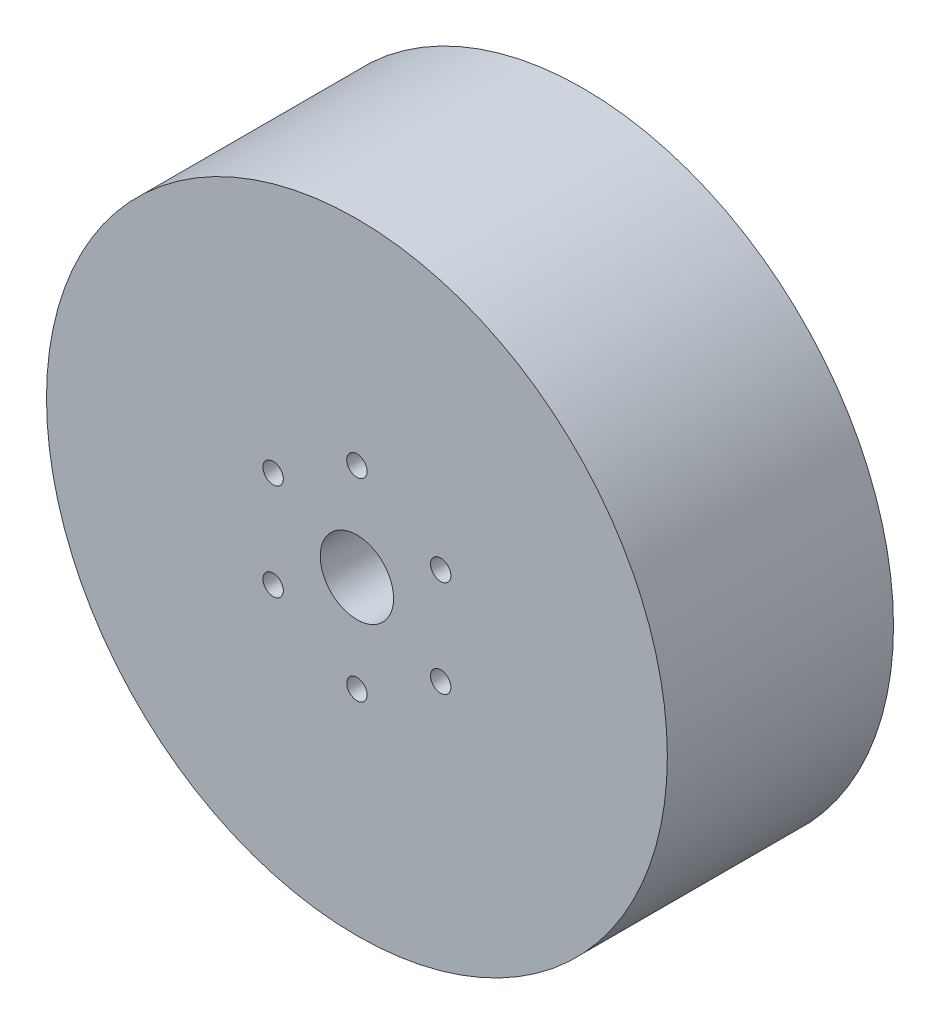
ISO-10303-21;
HEADER;
FILE_DESCRIPTION(('STEP AP214'),'2;1');
FILE_NAME('part.step','',(''),(''),'','','');
FILE_SCHEMA(('AUTOMOTIVE_DESIGN { 1 0 10303 214 1 1 1 1 }'));
ENDSEC;
DATA;
#1=APPLICATION_CONTEXT('core data for automotive mechanical design processes');
#2=APPLICATION_PROTOCOL_DEFINITION('international standard','automotive_design',2000,#1);
#3=PRODUCT_CONTEXT('',#1,'mechanical');
#4=PRODUCT('Part','Part','',(#3));
#5=PRODUCT_RELATED_PRODUCT_CATEGORY('part','',(#4));
#6=PRODUCT_DEFINITION_FORMATION('','',#4);
#7=PRODUCT_DEFINITION_CONTEXT('part definition',#1,'design');
#8=PRODUCT_DEFINITION('design','',#6,#7);
#9=PRODUCT_DEFINITION_SHAPE('','',#8);
#10=(LENGTH_UNIT() NAMED_UNIT(*) SI_UNIT(.MILLI.,.METRE.));
#11=(NAMED_UNIT(*) PLANE_ANGLE_UNIT() SI_UNIT($,.RADIAN.));
#12=(NAMED_UNIT(*) SI_UNIT($,.STERADIAN.) SOLID_ANGLE_UNIT());
#13=UNCERTAINTY_MEASURE_WITH_UNIT(LENGTH_MEASURE(1.E-05),#10,'distance_accuracy_value','');
#14=(GEOMETRIC_REPRESENTATION_CONTEXT(3) GLOBAL_UNCERTAINTY_ASSIGNED_CONTEXT((#13)) GLOBAL_UNIT_ASSIGNED_CONTEXT((#10,
#11,#12)) REPRESENTATION_CONTEXT('',''));
#15=CARTESIAN_POINT('',(0.,0.,0.));
#16=DIRECTION('',(0.,0.,1.));
#17=DIRECTION('',(1.,0.,0.));
#18=AXIS2_PLACEMENT_3D('',#15,#16,#17);
#19=CARTESIAN_POINT('',(0.,0.,55.52));
#20=DIRECTION('',(0.,0.,1.));
#21=DIRECTION('',(1.,0.,0.));
#22=AXIS2_PLACEMENT_3D('',#19,#20,#21);
#23=PLANE('',#22);
#24=CARTESIAN_POINT('',(-20.566603339879,-11.8758660254045,55.52));
#25=DIRECTION('',(0.,0.,1.));
#26=DIRECTION('',(1.,0.,0.));
#27=AXIS2_PLACEMENT_3D('',#24,#25,#26);
#28=CIRCLE('',#27,2.5);
#29=CARTESIAN_POINT('',(-18.066603339879,-11.8758660254045,55.52));
#30=VERTEX_POINT('',#29);
#31=EDGE_CURVE('E70',#30,#30,#28,.T.);
#32=ORIENTED_EDGE('',*,*,#31,.F.);
#33=EDGE_LOOP('',(#32));
#34=FACE_BOUND('',#33,.T.);
#35=CARTESIAN_POINT('',(20.5696033398819,-11.8741339745955,55.52));
#36=DIRECTION('',(0.,0.,1.));
#37=DIRECTION('',(1.,0.,0.));
#38=AXIS2_PLACEMENT_3D('',#35,#36,#37);
#39=CIRCLE('',#38,2.5);
#40=CARTESIAN_POINT('',(23.0696033398819,-11.8741339745955,55.52));
#41=VERTEX_POINT('',#40);
#42=EDGE_CURVE('E58',#41,#41,#39,.T.);
#43=ORIENTED_EDGE('',*,*,#42,.F.);
#44=EDGE_LOOP('',(#43));
#45=FACE_BOUND('',#44,.T.);
#46=CARTESIAN_POINT('',(0.,23.75,55.52));
#47=DIRECTION('',(0.,0.,1.));
#48=DIRECTION('',(1.,0.,0.));
#49=AXIS2_PLACEMENT_3D('',#46,#47,#48);
#50=CIRCLE('',#49,2.5);
#51=CARTESIAN_POINT('',(2.5,23.75,55.52));
#52=VERTEX_POINT('',#51);
#53=EDGE_CURVE('E46',#52,#52,#50,.T.);
#54=ORIENTED_EDGE('',*,*,#53,.F.);
#55=EDGE_LOOP('',(#54));
#56=FACE_BOUND('',#55,.T.);
#57=CARTESIAN_POINT('',(0.,0.,55.52));
#58=DIRECTION('',(0.,0.,1.));
#59=DIRECTION('',(1.,0.,0.));
#60=AXIS2_PLACEMENT_3D('',#57,#58,#59);
#61=CIRCLE('',#60,76.2);
#62=CARTESIAN_POINT('',(76.2,0.,55.52));
#63=VERTEX_POINT('',#62);
#64=EDGE_CURVE('E10',#63,#63,#61,.T.);
#65=ORIENTED_EDGE('',*,*,#64,.T.);
#66=EDGE_LOOP('',(#65));
#67=FACE_BOUND('',#66,.T.);
#68=CARTESIAN_POINT('',(0.,0.,55.52));
#69=DIRECTION('',(0.,0.,1.));
#70=DIRECTION('',(1.,0.,0.));
#71=AXIS2_PLACEMENT_3D('',#68,#69,#70);
#72=CIRCLE('',#71,9.);
#73=CARTESIAN_POINT('',(9.,0.,55.52));
#74=VERTEX_POINT('',#73);
#75=EDGE_CURVE('E41',#74,#74,#72,.T.);
#76=ORIENTED_EDGE('',*,*,#75,.F.);
#77=EDGE_LOOP('',(#76));
#78=FACE_BOUND('',#77,.T.);
#79=CARTESIAN_POINT('',(20.568603339881,11.8758660254046,55.52));
#80=DIRECTION('',(0.,0.,1.));
#81=DIRECTION('',(1.,0.,0.));
#82=AXIS2_PLACEMENT_3D('',#79,#80,#81);
#83=CIRCLE('',#82,2.5);
#84=CARTESIAN_POINT('',(23.068603339881,11.8758660254046,55.52));
#85=VERTEX_POINT('',#84);
#86=EDGE_CURVE('E52',#85,#85,#83,.T.);
#87=ORIENTED_EDGE('',*,*,#86,.F.);
#88=EDGE_LOOP('',(#87));
#89=FACE_BOUND('',#88,.T.);
#90=CARTESIAN_POINT('',(0.00200000000184575,-23.75,55.52));
#91=DIRECTION('',(0.,0.,1.));
#92=DIRECTION('',(1.,0.,0.));
#93=AXIS2_PLACEMENT_3D('',#90,#91,#92);
#94=CIRCLE('',#93,2.5);
#95=CARTESIAN_POINT('',(2.50200000000185,-23.75,55.52));
#96=VERTEX_POINT('',#95);
#97=EDGE_CURVE('E64',#96,#96,#94,.T.);
#98=ORIENTED_EDGE('',*,*,#97,.F.);
#99=EDGE_LOOP('',(#98));
#100=FACE_BOUND('',#99,.T.);
#101=CARTESIAN_POINT('',(-20.5676033398798,11.8741339745956,55.52));
#102=DIRECTION('',(0.,0.,1.));
#103=DIRECTION('',(1.,0.,0.));
#104=AXIS2_PLACEMENT_3D('',#101,#102,#103);
#105=CIRCLE('',#104,2.5);
#106=CARTESIAN_POINT('',(-18.0676033398798,11.8741339745956,55.52));
#107=VERTEX_POINT('',#106);
#108=EDGE_CURVE('E76',#107,#107,#105,.T.);
#109=ORIENTED_EDGE('',*,*,#108,.F.);
#110=EDGE_LOOP('',(#109));
#111=FACE_BOUND('',#110,.T.);
#112=ADVANCED_FACE('F30',(#34,#45,#56,#67,#78,#89,#100,#111),#23,.T.);
#113=CARTESIAN_POINT('',(0.,0.,0.));
#114=DIRECTION('',(0.,0.,1.));
#115=DIRECTION('',(1.,0.,0.));
#116=AXIS2_PLACEMENT_3D('',#113,#114,#115);
#117=PLANE('',#116);
#118=CARTESIAN_POINT('',(0.,0.,0.));
#119=DIRECTION('',(0.,0.,1.));
#120=DIRECTION('',(1.,0.,0.));
#121=AXIS2_PLACEMENT_3D('',#118,#119,#120);
#122=CIRCLE('',#121,76.2);
#123=CARTESIAN_POINT('',(76.2,0.,0.));
#124=VERTEX_POINT('',#123);
#125=EDGE_CURVE('E34',#124,#124,#122,.T.);
#126=ORIENTED_EDGE('',*,*,#125,.F.);
#127=EDGE_LOOP('',(#126));
#128=FACE_BOUND('',#127,.T.);
#129=CARTESIAN_POINT('',(0.,0.,0.));
#130=DIRECTION('',(0.,0.,1.));
#131=DIRECTION('',(1.,0.,0.));
#132=AXIS2_PLACEMENT_3D('',#129,#130,#131);
#133=CIRCLE('',#132,9.);
#134=CARTESIAN_POINT('',(9.,0.,0.));
#135=VERTEX_POINT('',#134);
#136=EDGE_CURVE('E43',#135,#135,#133,.T.);
#137=ORIENTED_EDGE('',*,*,#136,.T.);
#138=EDGE_LOOP('',(#137));
#139=FACE_BOUND('',#138,.T.);
#140=CARTESIAN_POINT('',(0.,23.75,0.));
#141=DIRECTION('',(0.,0.,1.));
#142=DIRECTION('',(1.,0.,0.));
#143=AXIS2_PLACEMENT_3D('',#140,#141,#142);
#144=CIRCLE('',#143,2.5);
#145=CARTESIAN_POINT('',(2.5,23.75,0.));
#146=VERTEX_POINT('',#145);
#147=EDGE_CURVE('E49',#146,#146,#144,.T.);
#148=ORIENTED_EDGE('',*,*,#147,.T.);
#149=EDGE_LOOP('',(#148));
#150=FACE_BOUND('',#149,.T.);
#151=CARTESIAN_POINT('',(20.568603339881,11.8758660254046,0.));
#152=DIRECTION('',(0.,0.,1.));
#153=DIRECTION('',(1.,0.,0.));
#154=AXIS2_PLACEMENT_3D('',#151,#152,#153);
#155=CIRCLE('',#154,2.5);
#156=CARTESIAN_POINT('',(23.068603339881,11.8758660254046,0.));
#157=VERTEX_POINT('',#156);
#158=EDGE_CURVE('E55',#157,#157,#155,.T.);
#159=ORIENTED_EDGE('',*,*,#158,.T.);
#160=EDGE_LOOP('',(#159));
#161=FACE_BOUND('',#160,.T.);
#162=CARTESIAN_POINT('',(20.5696033398819,-11.8741339745955,0.));
#163=DIRECTION('',(0.,0.,1.));
#164=DIRECTION('',(1.,0.,0.));
#165=AXIS2_PLACEMENT_3D('',#162,#163,#164);
#166=CIRCLE('',#165,2.5);
#167=CARTESIAN_POINT('',(23.0696033398819,-11.8741339745955,0.));
#168=VERTEX_POINT('',#167);
#169=EDGE_CURVE('E61',#168,#168,#166,.T.);
#170=ORIENTED_EDGE('',*,*,#169,.T.);
#171=EDGE_LOOP('',(#170));
#172=FACE_BOUND('',#171,.T.);
#173=CARTESIAN_POINT('',(0.00200000000184575,-23.75,0.));
#174=DIRECTION('',(0.,0.,1.));
#175=DIRECTION('',(1.,0.,0.));
#176=AXIS2_PLACEMENT_3D('',#173,#174,#175);
#177=CIRCLE('',#176,2.5);
#178=CARTESIAN_POINT('',(2.50200000000185,-23.75,0.));
#179=VERTEX_POINT('',#178);
#180=EDGE_CURVE('E67',#179,#179,#177,.T.);
#181=ORIENTED_EDGE('',*,*,#180,.T.);
#182=EDGE_LOOP('',(#181));
#183=FACE_BOUND('',#182,.T.);
#184=CARTESIAN_POINT('',(-20.566603339879,-11.8758660254045,0.));
#185=DIRECTION('',(0.,0.,1.));
#186=DIRECTION('',(1.,0.,0.));
#187=AXIS2_PLACEMENT_3D('',#184,#185,#186);
#188=CIRCLE('',#187,2.5);
#189=CARTESIAN_POINT('',(-18.066603339879,-11.8758660254045,0.));
#190=VERTEX_POINT('',#189);
#191=EDGE_CURVE('E73',#190,#190,#188,.T.);
#192=ORIENTED_EDGE('',*,*,#191,.T.);
#193=EDGE_LOOP('',(#192));
#194=FACE_BOUND('',#193,.T.);
#195=CARTESIAN_POINT('',(-20.5676033398798,11.8741339745956,0.));
#196=DIRECTION('',(0.,0.,1.));
#197=DIRECTION('',(1.,0.,0.));
#198=AXIS2_PLACEMENT_3D('',#195,#196,#197);
#199=CIRCLE('',#198,2.5);
#200=CARTESIAN_POINT('',(-18.0676033398798,11.8741339745956,0.));
#201=VERTEX_POINT('',#200);
#202=EDGE_CURVE('E79',#201,#201,#199,.T.);
#203=ORIENTED_EDGE('',*,*,#202,.T.);
#204=EDGE_LOOP('',(#203));
#205=FACE_BOUND('',#204,.T.);
#206=ADVANCED_FACE('F89',(#128,#139,#150,#161,#172,#183,#194,#205),#117,.F.);
#207=CARTESIAN_POINT('',(0.,0.,55.52));
#208=DIRECTION('',(0.,0.,-1.));
#209=DIRECTION('',(-1.,0.,0.));
#210=AXIS2_PLACEMENT_3D('',#207,#208,#209);
#211=CYLINDRICAL_SURFACE('',#210,76.2);
#212=ORIENTED_EDGE('',*,*,#64,.F.);
#213=EDGE_LOOP('',(#212));
#214=FACE_BOUND('',#213,.T.);
#215=ORIENTED_EDGE('',*,*,#125,.T.);
#216=EDGE_LOOP('',(#215));
#217=FACE_BOUND('',#216,.T.);
#218=ADVANCED_FACE('F32',(#214,#217),#211,.T.);
#219=CARTESIAN_POINT('',(0.,0.,55.52));
#220=DIRECTION('',(0.,0.,-1.));
#221=DIRECTION('',(-1.,0.,0.));
#222=AXIS2_PLACEMENT_3D('',#219,#220,#221);
#223=CYLINDRICAL_SURFACE('',#222,9.);
#224=ORIENTED_EDGE('',*,*,#75,.T.);
#225=EDGE_LOOP('',(#224));
#226=FACE_BOUND('',#225,.T.);
#227=ORIENTED_EDGE('',*,*,#136,.F.);
#228=EDGE_LOOP('',(#227));
#229=FACE_BOUND('',#228,.T.);
#230=ADVANCED_FACE('F99',(#226,#229),#223,.F.);
#231=CARTESIAN_POINT('',(0.,23.75,55.52));
#232=DIRECTION('',(0.,0.,-1.));
#233=DIRECTION('',(-1.,0.,0.));
#234=AXIS2_PLACEMENT_3D('',#231,#232,#233);
#235=CYLINDRICAL_SURFACE('',#234,2.5);
#236=ORIENTED_EDGE('',*,*,#53,.T.);
#237=EDGE_LOOP('',(#236));
#238=FACE_BOUND('',#237,.T.);
#239=ORIENTED_EDGE('',*,*,#147,.F.);
#240=EDGE_LOOP('',(#239));
#241=FACE_BOUND('',#240,.T.);
#242=ADVANCED_FACE('F102',(#238,#241),#235,.F.);
#243=CARTESIAN_POINT('',(20.568603339881,11.8758660254046,55.52));
#244=DIRECTION('',(0.,0.,-1.));
#245=DIRECTION('',(-1.,0.,0.));
#246=AXIS2_PLACEMENT_3D('',#243,#244,#245);
#247=CYLINDRICAL_SURFACE('',#246,2.5);
#248=ORIENTED_EDGE('',*,*,#86,.T.);
#249=EDGE_LOOP('',(#248));
#250=FACE_BOUND('',#249,.T.);
#251=ORIENTED_EDGE('',*,*,#158,.F.);
#252=EDGE_LOOP('',(#251));
#253=FACE_BOUND('',#252,.T.);
#254=ADVANCED_FACE('F106',(#250,#253),#247,.F.);
#255=CARTESIAN_POINT('',(20.5696033398819,-11.8741339745955,55.52));
#256=DIRECTION('',(0.,0.,-1.));
#257=DIRECTION('',(-1.,0.,0.));
#258=AXIS2_PLACEMENT_3D('',#255,#256,#257);
#259=CYLINDRICAL_SURFACE('',#258,2.5);
#260=ORIENTED_EDGE('',*,*,#42,.T.);
#261=EDGE_LOOP('',(#260));
#262=FACE_BOUND('',#261,.T.);
#263=ORIENTED_EDGE('',*,*,#169,.F.);
#264=EDGE_LOOP('',(#263));
#265=FACE_BOUND('',#264,.T.);
#266=ADVANCED_FACE('F110',(#262,#265),#259,.F.);
#267=CARTESIAN_POINT('',(0.00200000000184575,-23.75,55.52));
#268=DIRECTION('',(0.,0.,-1.));
#269=DIRECTION('',(-1.,0.,0.));
#270=AXIS2_PLACEMENT_3D('',#267,#268,#269);
#271=CYLINDRICAL_SURFACE('',#270,2.5);
#272=ORIENTED_EDGE('',*,*,#97,.T.);
#273=EDGE_LOOP('',(#272));
#274=FACE_BOUND('',#273,.T.);
#275=ORIENTED_EDGE('',*,*,#180,.F.);
#276=EDGE_LOOP('',(#275));
#277=FACE_BOUND('',#276,.T.);
#278=ADVANCED_FACE('F114',(#274,#277),#271,.F.);
#279=CARTESIAN_POINT('',(-20.566603339879,-11.8758660254045,55.52));
#280=DIRECTION('',(0.,0.,-1.));
#281=DIRECTION('',(-1.,0.,0.));
#282=AXIS2_PLACEMENT_3D('',#279,#280,#281);
#283=CYLINDRICAL_SURFACE('',#282,2.5);
#284=ORIENTED_EDGE('',*,*,#31,.T.);
#285=EDGE_LOOP('',(#284));
#286=FACE_BOUND('',#285,.T.);
#287=ORIENTED_EDGE('',*,*,#191,.F.);
#288=EDGE_LOOP('',(#287));
#289=FACE_BOUND('',#288,.T.);
#290=ADVANCED_FACE('F118',(#286,#289),#283,.F.);
#291=CARTESIAN_POINT('',(-20.5676033398798,11.8741339745956,55.52));
#292=DIRECTION('',(0.,0.,-1.));
#293=DIRECTION('',(-1.,0.,0.));
#294=AXIS2_PLACEMENT_3D('',#291,#292,#293);
#295=CYLINDRICAL_SURFACE('',#294,2.5);
#296=ORIENTED_EDGE('',*,*,#108,.T.);
#297=EDGE_LOOP('',(#296));
#298=FACE_BOUND('',#297,.T.);
#299=ORIENTED_EDGE('',*,*,#202,.F.);
#300=EDGE_LOOP('',(#299));
#301=FACE_BOUND('',#300,.T.);
#302=ADVANCED_FACE('F85',(#298,#301),#295,.F.);
#303=CLOSED_SHELL('',(#112,#206,#218,#230,#242,#254,#266,#278,#290,#302));
#304=MANIFOLD_SOLID_BREP('B2',#303);
#305=ADVANCED_BREP_SHAPE_REPRESENTATION('',(#18,#304),#14);
#306=SHAPE_DEFINITION_REPRESENTATION(#9,#305);
ENDSEC;
END-ISO-10303-21;
